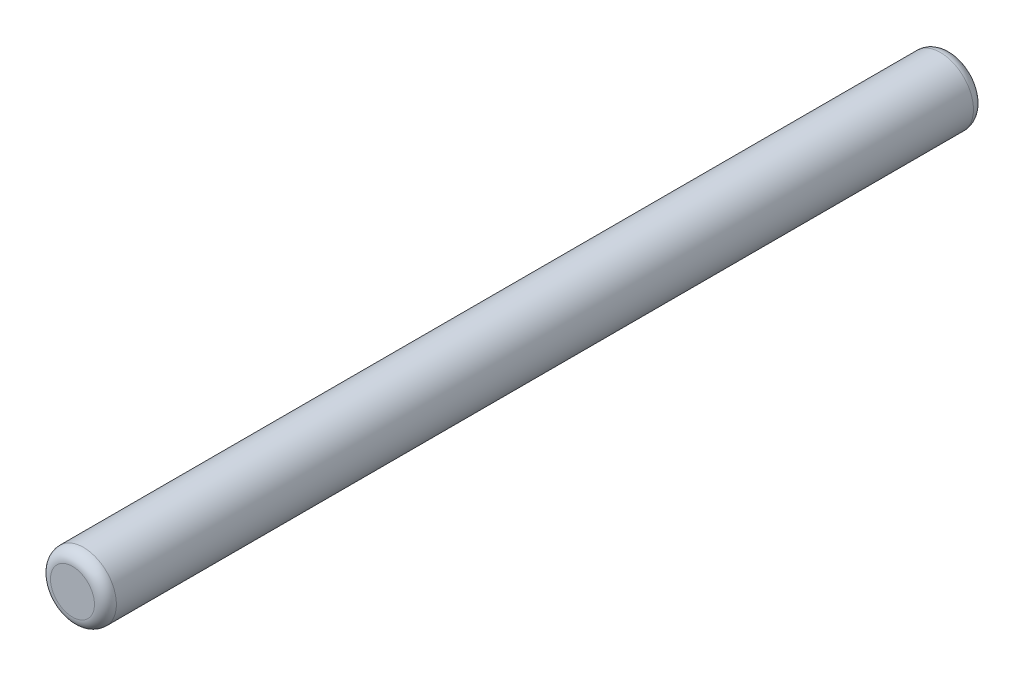
ISO-10303-21;
HEADER;
FILE_DESCRIPTION(('STEP AP214'),'2;1');
FILE_NAME('part.step','',(''),(''),'','','');
FILE_SCHEMA(('AUTOMOTIVE_DESIGN { 1 0 10303 214 1 1 1 1 }'));
ENDSEC;
DATA;
#1=APPLICATION_CONTEXT('core data for automotive mechanical design processes');
#2=APPLICATION_PROTOCOL_DEFINITION('international standard','automotive_design',2000,#1);
#3=PRODUCT_CONTEXT('',#1,'mechanical');
#4=PRODUCT('Part','Part','',(#3));
#5=PRODUCT_RELATED_PRODUCT_CATEGORY('part','',(#4));
#6=PRODUCT_DEFINITION_FORMATION('','',#4);
#7=PRODUCT_DEFINITION_CONTEXT('part definition',#1,'design');
#8=PRODUCT_DEFINITION('design','',#6,#7);
#9=PRODUCT_DEFINITION_SHAPE('','',#8);
#10=(LENGTH_UNIT() NAMED_UNIT(*) SI_UNIT(.MILLI.,.METRE.));
#11=(NAMED_UNIT(*) PLANE_ANGLE_UNIT() SI_UNIT($,.RADIAN.));
#12=(NAMED_UNIT(*) SI_UNIT($,.STERADIAN.) SOLID_ANGLE_UNIT());
#13=UNCERTAINTY_MEASURE_WITH_UNIT(LENGTH_MEASURE(1.E-05),#10,'distance_accuracy_value','');
#14=(GEOMETRIC_REPRESENTATION_CONTEXT(3) GLOBAL_UNCERTAINTY_ASSIGNED_CONTEXT((#13)) GLOBAL_UNIT_ASSIGNED_CONTEXT((#10,
#11,#12)) REPRESENTATION_CONTEXT('',''));
#15=CARTESIAN_POINT('',(0.,0.,0.));
#16=DIRECTION('',(0.,0.,1.));
#17=DIRECTION('',(1.,0.,0.));
#18=AXIS2_PLACEMENT_3D('',#15,#16,#17);
#19=CARTESIAN_POINT('',(0.,0.,80.));
#20=DIRECTION('',(0.,0.,-1.));
#21=DIRECTION('',(-1.,0.,0.));
#22=AXIS2_PLACEMENT_3D('',#19,#20,#21);
#23=CYLINDRICAL_SURFACE('',#22,3.);
#24=CARTESIAN_POINT('',(0.,0.,79.));
#25=DIRECTION('',(0.,0.,1.));
#26=DIRECTION('',(1.,0.,0.));
#27=AXIS2_PLACEMENT_3D('',#24,#25,#26);
#28=CIRCLE('',#27,3.);
#29=CARTESIAN_POINT('',(3.,0.,79.));
#30=VERTEX_POINT('',#29);
#31=EDGE_CURVE('E38',#30,#30,#28,.F.);
#32=ORIENTED_EDGE('',*,*,#31,.T.);
#33=EDGE_LOOP('',(#32));
#34=FACE_BOUND('',#33,.T.);
#35=CARTESIAN_POINT('',(0.,0.,1.));
#36=DIRECTION('',(0.,0.,1.));
#37=DIRECTION('',(1.,0.,0.));
#38=AXIS2_PLACEMENT_3D('',#35,#36,#37);
#39=CIRCLE('',#38,3.);
#40=CARTESIAN_POINT('',(3.,0.,1.));
#41=VERTEX_POINT('',#40);
#42=EDGE_CURVE('E42',#41,#41,#39,.T.);
#43=ORIENTED_EDGE('',*,*,#42,.T.);
#44=EDGE_LOOP('',(#43));
#45=FACE_BOUND('',#44,.T.);
#46=ADVANCED_FACE('F31',(#34,#45),#23,.T.);
#47=CARTESIAN_POINT('',(0.,0.,80.));
#48=DIRECTION('',(0.,0.,1.));
#49=DIRECTION('',(1.,0.,0.));
#50=AXIS2_PLACEMENT_3D('',#47,#48,#49);
#51=PLANE('',#50);
#52=CARTESIAN_POINT('',(0.,0.,80.));
#53=DIRECTION('',(0.,0.,1.));
#54=DIRECTION('',(1.,0.,0.));
#55=AXIS2_PLACEMENT_3D('',#52,#53,#54);
#56=CIRCLE('',#55,2.);
#57=CARTESIAN_POINT('',(2.,0.,80.));
#58=VERTEX_POINT('',#57);
#59=EDGE_CURVE('E46',#58,#58,#56,.T.);
#60=ORIENTED_EDGE('',*,*,#59,.T.);
#61=EDGE_LOOP('',(#60));
#62=FACE_BOUND('',#61,.T.);
#63=ADVANCED_FACE('F52',(#62),#51,.T.);
#64=CARTESIAN_POINT('',(0.,0.,0.));
#65=DIRECTION('',(0.,0.,1.));
#66=DIRECTION('',(1.,0.,0.));
#67=AXIS2_PLACEMENT_3D('',#64,#65,#66);
#68=PLANE('',#67);
#69=CARTESIAN_POINT('',(0.,0.,0.));
#70=DIRECTION('',(0.,0.,1.));
#71=DIRECTION('',(1.,0.,0.));
#72=AXIS2_PLACEMENT_3D('',#69,#70,#71);
#73=CIRCLE('',#72,2.);
#74=CARTESIAN_POINT('',(2.,0.,0.));
#75=VERTEX_POINT('',#74);
#76=EDGE_CURVE('E10',#75,#75,#73,.F.);
#77=ORIENTED_EDGE('',*,*,#76,.T.);
#78=EDGE_LOOP('',(#77));
#79=FACE_BOUND('',#78,.T.);
#80=ADVANCED_FACE('F56',(#79),#68,.F.);
#81=CARTESIAN_POINT('',(0.,0.,79.));
#82=DIRECTION('',(0.,0.,1.));
#83=DIRECTION('',(1.,0.,0.));
#84=AXIS2_PLACEMENT_3D('',#81,#82,#83);
#85=TOROIDAL_SURFACE('',#84,2.,1.);
#86=ORIENTED_EDGE('',*,*,#31,.F.);
#87=EDGE_LOOP('',(#86));
#88=FACE_BOUND('',#87,.T.);
#89=ORIENTED_EDGE('',*,*,#59,.F.);
#90=EDGE_LOOP('',(#89));
#91=FACE_BOUND('',#90,.T.);
#92=ADVANCED_FACE('F54',(#88,#91),#85,.T.);
#93=CARTESIAN_POINT('',(0.,0.,1.));
#94=DIRECTION('',(0.,0.,1.));
#95=DIRECTION('',(1.,0.,0.));
#96=AXIS2_PLACEMENT_3D('',#93,#94,#95);
#97=TOROIDAL_SURFACE('',#96,2.,1.);
#98=ORIENTED_EDGE('',*,*,#76,.F.);
#99=EDGE_LOOP('',(#98));
#100=FACE_BOUND('',#99,.T.);
#101=ORIENTED_EDGE('',*,*,#42,.F.);
#102=EDGE_LOOP('',(#101));
#103=FACE_BOUND('',#102,.T.);
#104=ADVANCED_FACE('F33',(#100,#103),#97,.T.);
#105=CLOSED_SHELL('',(#46,#63,#80,#92,#104));
#106=MANIFOLD_SOLID_BREP('B2',#105);
#107=ADVANCED_BREP_SHAPE_REPRESENTATION('',(#18,#106),#14);
#108=SHAPE_DEFINITION_REPRESENTATION(#9,#107);
ENDSEC;
END-ISO-10303-21;
